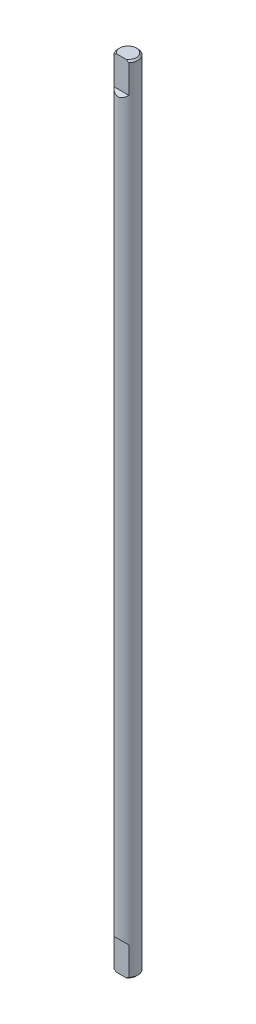
ISO-10303-21;
HEADER;
FILE_DESCRIPTION(('STEP AP214'),'2;1');
FILE_NAME('part.step','',(''),(''),'','','');
FILE_SCHEMA(('AUTOMOTIVE_DESIGN { 1 0 10303 214 1 1 1 1 }'));
ENDSEC;
DATA;
#1=APPLICATION_CONTEXT('core data for automotive mechanical design processes');
#2=APPLICATION_PROTOCOL_DEFINITION('international standard','automotive_design',2000,#1);
#3=PRODUCT_CONTEXT('',#1,'mechanical');
#4=PRODUCT('Part','Part','',(#3));
#5=PRODUCT_RELATED_PRODUCT_CATEGORY('part','',(#4));
#6=PRODUCT_DEFINITION_FORMATION('','',#4);
#7=PRODUCT_DEFINITION_CONTEXT('part definition',#1,'design');
#8=PRODUCT_DEFINITION('design','',#6,#7);
#9=PRODUCT_DEFINITION_SHAPE('','',#8);
#10=(LENGTH_UNIT() NAMED_UNIT(*) SI_UNIT(.MILLI.,.METRE.));
#11=(NAMED_UNIT(*) PLANE_ANGLE_UNIT() SI_UNIT($,.RADIAN.));
#12=(NAMED_UNIT(*) SI_UNIT($,.STERADIAN.) SOLID_ANGLE_UNIT());
#13=UNCERTAINTY_MEASURE_WITH_UNIT(LENGTH_MEASURE(1.E-05),#10,'distance_accuracy_value','');
#14=(GEOMETRIC_REPRESENTATION_CONTEXT(3) GLOBAL_UNCERTAINTY_ASSIGNED_CONTEXT((#13)) GLOBAL_UNIT_ASSIGNED_CONTEXT((#10,
#11,#12)) REPRESENTATION_CONTEXT('',''));
#15=CARTESIAN_POINT('',(0.,0.,0.));
#16=DIRECTION('',(0.,0.,1.));
#17=DIRECTION('',(1.,0.,0.));
#18=AXIS2_PLACEMENT_3D('',#15,#16,#17);
#19=CARTESIAN_POINT('',(0.,240.,0.));
#20=DIRECTION('',(0.,-1.,0.));
#21=DIRECTION('',(0.,0.,-1.));
#22=AXIS2_PLACEMENT_3D('',#19,#20,#21);
#23=CYLINDRICAL_SURFACE('',#22,3.);
#24=CARTESIAN_POINT('',(0.,239.5,0.));
#25=DIRECTION('',(0.,1.,0.));
#26=DIRECTION('',(0.,0.,1.));
#27=AXIS2_PLACEMENT_3D('',#24,#25,#26);
#28=CIRCLE('',#27,3.);
#29=CARTESIAN_POINT('',(-2.23606797749979,239.5,2.));
#30=VERTEX_POINT('',#29);
#31=CARTESIAN_POINT('',(2.23606797749979,239.5,2.));
#32=VERTEX_POINT('',#31);
#33=EDGE_CURVE('E118',#30,#32,#28,.F.);
#34=ORIENTED_EDGE('',*,*,#33,.T.);
#35=DIRECTION('',(0.,-1.,0.));
#36=VECTOR('',#35,1.);
#37=CARTESIAN_POINT('',(2.23606797749979,240.,2.));
#38=LINE('',#37,#36);
#39=CARTESIAN_POINT('',(2.23606797749979,231.,2.));
#40=VERTEX_POINT('',#39);
#41=EDGE_CURVE('E174',#32,#40,#38,.T.);
#42=ORIENTED_EDGE('',*,*,#41,.T.);
#43=CARTESIAN_POINT('',(0.,233.,0.));
#44=DIRECTION('',(0.,-0.707106781186538,-0.707106781186557));
#45=DIRECTION('',(0.,-0.707106781186557,0.707106781186538));
#46=AXIS2_PLACEMENT_3D('',#43,#44,#45);
#47=ELLIPSE('',#46,4.24264068711935,3.);
#48=CARTESIAN_POINT('',(0.,230.,3.));
#49=VERTEX_POINT('',#48);
#50=EDGE_CURVE('E59',#40,#49,#47,.T.);
#51=ORIENTED_EDGE('',*,*,#50,.T.);
#52=CARTESIAN_POINT('',(0.,233.,0.));
#53=DIRECTION('',(0.,-0.707106781186538,-0.707106781186557));
#54=DIRECTION('',(0.,-0.707106781186557,0.707106781186538));
#55=AXIS2_PLACEMENT_3D('',#52,#53,#54);
#56=ELLIPSE('',#55,4.24264068711935,3.);
#57=CARTESIAN_POINT('',(-2.23606797749979,231.,2.));
#58=VERTEX_POINT('',#57);
#59=EDGE_CURVE('E178',#49,#58,#56,.T.);
#60=ORIENTED_EDGE('',*,*,#59,.T.);
#61=DIRECTION('',(0.,-1.,0.));
#62=VECTOR('',#61,1.);
#63=CARTESIAN_POINT('',(-2.23606797749979,240.,2.));
#64=LINE('',#63,#62);
#65=EDGE_CURVE('E176',#58,#30,#64,.F.);
#66=ORIENTED_EDGE('',*,*,#65,.T.);
#67=EDGE_LOOP('',(#34,#42,#51,#60,#66));
#68=FACE_BOUND('',#67,.T.);
#69=CARTESIAN_POINT('',(0.,6.99999999999992,0.));
#70=DIRECTION('',(0.,0.707106781186538,-0.707106781186557));
#71=DIRECTION('',(0.,-0.707106781186557,-0.707106781186538));
#72=AXIS2_PLACEMENT_3D('',#69,#70,#71);
#73=ELLIPSE('',#72,4.24264068711935,3.);
#74=CARTESIAN_POINT('',(-2.23606797749979,8.99999999999998,2.));
#75=VERTEX_POINT('',#74);
#76=CARTESIAN_POINT('',(0.,10.,3.));
#77=VERTEX_POINT('',#76);
#78=EDGE_CURVE('E46',#75,#77,#73,.T.);
#79=ORIENTED_EDGE('',*,*,#78,.T.);
#80=CARTESIAN_POINT('',(0.,6.99999999999992,0.));
#81=DIRECTION('',(0.,0.707106781186538,-0.707106781186557));
#82=DIRECTION('',(0.,-0.707106781186557,-0.707106781186538));
#83=AXIS2_PLACEMENT_3D('',#80,#81,#82);
#84=ELLIPSE('',#83,4.24264068711935,3.);
#85=CARTESIAN_POINT('',(2.23606797749979,8.99999999999998,2.));
#86=VERTEX_POINT('',#85);
#87=EDGE_CURVE('E11',#77,#86,#84,.T.);
#88=ORIENTED_EDGE('',*,*,#87,.T.);
#89=DIRECTION('',(0.,-1.,0.));
#90=VECTOR('',#89,1.);
#91=CARTESIAN_POINT('',(2.23606797749979,240.,2.));
#92=LINE('',#91,#90);
#93=CARTESIAN_POINT('',(2.23606797749979,0.500000000000028,2.));
#94=VERTEX_POINT('',#93);
#95=EDGE_CURVE('E114',#86,#94,#92,.T.);
#96=ORIENTED_EDGE('',*,*,#95,.T.);
#97=CARTESIAN_POINT('',(0.,0.500000000000028,0.));
#98=DIRECTION('',(0.,1.,0.));
#99=DIRECTION('',(0.,0.,1.));
#100=AXIS2_PLACEMENT_3D('',#97,#98,#99);
#101=CIRCLE('',#100,3.);
#102=CARTESIAN_POINT('',(-2.23606797749979,0.500000000000028,2.));
#103=VERTEX_POINT('',#102);
#104=EDGE_CURVE('E121',#94,#103,#101,.T.);
#105=ORIENTED_EDGE('',*,*,#104,.T.);
#106=DIRECTION('',(0.,-1.,0.));
#107=VECTOR('',#106,1.);
#108=CARTESIAN_POINT('',(-2.23606797749979,240.,2.));
#109=LINE('',#108,#107);
#110=EDGE_CURVE('E102',#103,#75,#109,.F.);
#111=ORIENTED_EDGE('',*,*,#110,.T.);
#112=EDGE_LOOP('',(#79,#88,#96,#105,#111));
#113=FACE_BOUND('',#112,.T.);
#114=ADVANCED_FACE('F37',(#68,#113),#23,.T.);
#115=CARTESIAN_POINT('',(0.,240.,0.));
#116=DIRECTION('',(0.,1.,0.));
#117=DIRECTION('',(0.,0.,1.));
#118=AXIS2_PLACEMENT_3D('',#115,#116,#117);
#119=PLANE('',#118);
#120=DIRECTION('',(-1.,0.,0.));
#121=VECTOR('',#120,1.);
#122=CARTESIAN_POINT('',(-3.00000000000003,240.,2.));
#123=LINE('',#122,#121);
#124=CARTESIAN_POINT('',(1.49999999999991,240.,2.));
#125=VERTEX_POINT('',#124);
#126=CARTESIAN_POINT('',(-1.49999999999996,240.,2.));
#127=VERTEX_POINT('',#126);
#128=EDGE_CURVE('E115',#125,#127,#123,.T.);
#129=ORIENTED_EDGE('',*,*,#128,.F.);
#130=CARTESIAN_POINT('',(0.,240.,0.));
#131=DIRECTION('',(0.,1.,0.));
#132=DIRECTION('',(0.,0.,1.));
#133=AXIS2_PLACEMENT_3D('',#130,#131,#132);
#134=CIRCLE('',#133,2.49999999999997);
#135=EDGE_CURVE('E171',#125,#127,#134,.T.);
#136=ORIENTED_EDGE('',*,*,#135,.T.);
#137=EDGE_LOOP('',(#129,#136));
#138=FACE_BOUND('',#137,.T.);
#139=ADVANCED_FACE('F148',(#138),#119,.T.);
#140=CARTESIAN_POINT('',(0.,0.,0.));
#141=DIRECTION('',(0.,1.,0.));
#142=DIRECTION('',(0.,0.,1.));
#143=AXIS2_PLACEMENT_3D('',#140,#141,#142);
#144=PLANE('',#143);
#145=CARTESIAN_POINT('',(0.,0.,0.));
#146=DIRECTION('',(0.,1.,0.));
#147=DIRECTION('',(0.,0.,1.));
#148=AXIS2_PLACEMENT_3D('',#145,#146,#147);
#149=CIRCLE('',#148,2.49999999999997);
#150=CARTESIAN_POINT('',(-1.49999999999996,0.,2.));
#151=VERTEX_POINT('',#150);
#152=CARTESIAN_POINT('',(1.49999999999996,0.,2.));
#153=VERTEX_POINT('',#152);
#154=EDGE_CURVE('E113',#151,#153,#149,.F.);
#155=ORIENTED_EDGE('',*,*,#154,.T.);
#156=DIRECTION('',(1.,0.,0.));
#157=VECTOR('',#156,1.);
#158=CARTESIAN_POINT('',(-3.,0.,2.));
#159=LINE('',#158,#157);
#160=EDGE_CURVE('E99',#151,#153,#159,.T.);
#161=ORIENTED_EDGE('',*,*,#160,.F.);
#162=EDGE_LOOP('',(#155,#161));
#163=FACE_BOUND('',#162,.T.);
#164=ADVANCED_FACE('F112',(#163),#144,.F.);
#165=CARTESIAN_POINT('',(0.,240.,0.));
#166=DIRECTION('',(0.,-1.,0.));
#167=DIRECTION('',(0.,0.,-1.));
#168=AXIS2_PLACEMENT_3D('',#165,#166,#167);
#169=CONICAL_SURFACE('',#168,2.49999999999997,0.785398163397474);
#170=CARTESIAN_POINT('',(2.23700703843326,239.4993,2.));
#171=CARTESIAN_POINT('',(2.1795537550045,239.542119696693,2.));
#172=CARTESIAN_POINT('',(2.12175595723193,239.584485341499,2.));
#173=CARTESIAN_POINT('',(2.00532857151726,239.66809552539,2.));
#174=CARTESIAN_POINT('',(1.9466987279959,239.709339708131,2.));
#175=CARTESIAN_POINT('',(1.82791607476457,239.790867859145,2.));
#176=CARTESIAN_POINT('',(1.76775393847621,239.831138300867,2.));
#177=CARTESIAN_POINT('',(1.64632608074995,239.909969954931,2.));
#178=CARTESIAN_POINT('',(1.58506045455726,239.948531313805,2.));
#179=CARTESIAN_POINT('',(1.45793072930444,240.025557004111,2.));
#180=CARTESIAN_POINT('',(1.39199585503251,240.063906019636,2.));
#181=CARTESIAN_POINT('',(1.25849647756776,240.137645313793,2.));
#182=CARTESIAN_POINT('',(1.19093162931531,240.173034958729,2.));
#183=CARTESIAN_POINT('',(0.985963971062652,240.273358848503,2.));
#184=CARTESIAN_POINT('',(0.845675225829964,240.332835727171,2.));
#185=CARTESIAN_POINT('',(0.633672942198189,240.402985344966,2.));
#186=CARTESIAN_POINT('',(0.564986427364803,240.422823476613,2.));
#187=CARTESIAN_POINT('',(0.426067021922629,240.456231615327,2.));
#188=CARTESIAN_POINT('',(0.355834083227638,240.469801427191,2.));
#189=CARTESIAN_POINT('',(0.215656238630577,240.489579899771,2.));
#190=CARTESIAN_POINT('',(0.145730344407479,240.495920993378,2.));
#191=CARTESIAN_POINT('',(0.00559765577090717,240.501217509735,2.));
#192=CARTESIAN_POINT('',(-0.0646091160497045,240.500173515036,2.));
#193=CARTESIAN_POINT('',(-0.204457441049283,240.490787096985,2.));
#194=CARTESIAN_POINT('',(-0.274099451586293,240.482451335222,2.));
#195=CARTESIAN_POINT('',(-0.412243838195358,240.459092417786,2.));
#196=CARTESIAN_POINT('',(-0.480745979766243,240.44406790328,2.));
#197=CARTESIAN_POINT('',(-0.617448335458684,240.407917020328,2.));
#198=CARTESIAN_POINT('',(-0.685619698346276,240.386683260854,2.));
#199=CARTESIAN_POINT('',(-0.820190919096238,240.339271159789,2.));
#200=CARTESIAN_POINT('',(-0.886590808713243,240.3130929069,2.));
#201=CARTESIAN_POINT('',(-1.07054353362767,240.234035999192,2.));
#202=CARTESIAN_POINT('',(-1.18615194105939,240.176653682816,2.));
#203=CARTESIAN_POINT('',(-1.41274654442434,240.053202363559,2.));
#204=CARTESIAN_POINT('',(-1.52372413929133,239.987118067994,2.));
#205=CARTESIAN_POINT('',(-1.73664107383193,239.852459193466,2.));
#206=CARTESIAN_POINT('',(-1.83875748602178,239.78416204637,2.));
#207=CARTESIAN_POINT('',(-1.9897358196562,239.679049816604,2.));
#208=CARTESIAN_POINT('',(-2.03959293596968,239.643645516368,2.));
#209=CARTESIAN_POINT('',(-2.13871944100795,239.572039976508,2.));
#210=CARTESIAN_POINT('',(-2.1879889260501,239.535838870334,2.));
#211=CARTESIAN_POINT('',(-2.23700703843326,239.4993,2.));
#212=B_SPLINE_CURVE_WITH_KNOTS('',3,(#170,#171,#172,#173,#174,#175,#176,#177,#178,#179,#180,
#181,#182,#183,#184,#185,#186,#187,#188,#189,#190,#191,#192,#193,#194,#195,#196,#197,#198,#199,
#200,#201,#202,#203,#204,#205,#206,#207,#208,#209,#210,#211),.UNSPECIFIED.,.F.,.F.,(4,2,2,2,2,2,
2,2,2,2,2,2,2,2,2,2,2,2,2,2,4),(0.,0.214969205468666,0.430005937146404,0.647168879660764,
0.864313167232117,1.0930619511881,1.32185959290738,1.77728613144308,1.99153696336321,
2.2057944668692,2.41606021515297,2.62630937740591,2.83636666125516,3.04646663808105,
3.26044016474785,3.47440985324055,3.86098427284734,4.24824735060579,4.61667573350197,
4.80011706932143,4.98352791262719),.UNSPECIFIED.);
#213=EDGE_CURVE('E168',#32,#125,#212,.T.);
#214=ORIENTED_EDGE('',*,*,#213,.F.);
#215=ORIENTED_EDGE('',*,*,#33,.F.);
#216=EDGE_CURVE('E107',#127,#30,#212,.T.);
#217=ORIENTED_EDGE('',*,*,#216,.F.);
#218=ORIENTED_EDGE('',*,*,#135,.F.);
#219=EDGE_LOOP('',(#214,#215,#217,#218));
#220=FACE_BOUND('',#219,.T.);
#221=ADVANCED_FACE('F154',(#220),#169,.T.);
#222=CARTESIAN_POINT('',(0.,0.500000000000028,0.));
#223=DIRECTION('',(0.,1.,0.));
#224=DIRECTION('',(0.,0.,1.));
#225=AXIS2_PLACEMENT_3D('',#222,#223,#224);
#226=CONICAL_SURFACE('',#225,3.,0.785398163397446);
#227=CARTESIAN_POINT('',(-2.23700703843327,0.500700000000028,2.));
#228=CARTESIAN_POINT('',(-2.1795537550045,0.457880303307511,2.));
#229=CARTESIAN_POINT('',(-2.12175595723193,0.415514658500729,2.));
#230=CARTESIAN_POINT('',(-2.00532857151726,0.331904474610336,2.));
#231=CARTESIAN_POINT('',(-1.94669872799591,0.290660291869172,2.));
#232=CARTESIAN_POINT('',(-1.82791607476458,0.209132140854715,2.));
#233=CARTESIAN_POINT('',(-1.76775393847622,0.168861699133128,2.));
#234=CARTESIAN_POINT('',(-1.64632608074996,0.090030045068839,2.));
#235=CARTESIAN_POINT('',(-1.58506045455726,0.0514686861954147,2.));
#236=CARTESIAN_POINT('',(-1.45793072930445,-0.0255570041113463,2.));
#237=CARTESIAN_POINT('',(-1.39199585503251,-0.0639060196358761,2.));
#238=CARTESIAN_POINT('',(-1.25849647756776,-0.137645313793167,2.));
#239=CARTESIAN_POINT('',(-1.19093162931532,-0.173034958728774,2.));
#240=CARTESIAN_POINT('',(-0.98596397106267,-0.273358848503127,2.));
#241=CARTESIAN_POINT('',(-0.845675225829986,-0.332835727170973,2.));
#242=CARTESIAN_POINT('',(-0.63367294219821,-0.402985344966284,2.));
#243=CARTESIAN_POINT('',(-0.564986427364823,-0.422823476613027,2.));
#244=CARTESIAN_POINT('',(-0.426067021922656,-0.45623161532696,2.));
#245=CARTESIAN_POINT('',(-0.355834083227672,-0.469801427190927,2.));
#246=CARTESIAN_POINT('',(-0.215656238630622,-0.489579899771116,2.));
#247=CARTESIAN_POINT('',(-0.145730344407527,-0.495920993378348,2.));
#248=CARTESIAN_POINT('',(-0.00559765577096054,-0.501217509734879,2.));
#249=CARTESIAN_POINT('',(0.064609116049648,-0.500173515035874,2.));
#250=CARTESIAN_POINT('',(0.20445744104922,-0.490787096984796,2.));
#251=CARTESIAN_POINT('',(0.274099451586228,-0.482451335222434,2.));
#252=CARTESIAN_POINT('',(0.412243838195289,-0.459092417785742,2.));
#253=CARTESIAN_POINT('',(0.480745979766171,-0.444067903280064,2.));
#254=CARTESIAN_POINT('',(0.617448335458606,-0.407917020328268,2.));
#255=CARTESIAN_POINT('',(0.685619698346196,-0.386683260853592,2.));
#256=CARTESIAN_POINT('',(0.820190919096152,-0.339271159788855,2.));
#257=CARTESIAN_POINT('',(0.886590808713155,-0.313092906899623,2.));
#258=CARTESIAN_POINT('',(1.07054353362759,-0.23403599919159,2.));
#259=CARTESIAN_POINT('',(1.18615194105932,-0.176653682815571,2.));
#260=CARTESIAN_POINT('',(1.41274654442429,-0.0532023635590676,2.));
#261=CARTESIAN_POINT('',(1.52372413929129,0.012881932006253,2.));
#262=CARTESIAN_POINT('',(1.73664107383192,0.147540806534191,2.));
#263=CARTESIAN_POINT('',(1.83875748602178,0.215837953630048,2.));
#264=CARTESIAN_POINT('',(1.98973581965621,0.320950183396226,2.));
#265=CARTESIAN_POINT('',(2.03959293596968,0.356354483632019,2.));
#266=CARTESIAN_POINT('',(2.13871944100795,0.427960023491586,2.));
#267=CARTESIAN_POINT('',(2.18798892605011,0.46416112966596,2.));
#268=CARTESIAN_POINT('',(2.23700703843327,0.500700000000028,2.));
#269=B_SPLINE_CURVE_WITH_KNOTS('',3,(#227,#228,#229,#230,#231,#232,#233,#234,#235,#236,#237,
#238,#239,#240,#241,#242,#243,#244,#245,#246,#247,#248,#249,#250,#251,#252,#253,#254,#255,#256,
#257,#258,#259,#260,#261,#262,#263,#264,#265,#266,#267,#268),.UNSPECIFIED.,.F.,.F.,(4,2,2,2,2,2,
2,2,2,2,2,2,2,2,2,2,2,2,2,2,4),(0.,0.214969205468677,0.430005937146424,0.647168879660777,
0.864313167232137,1.09306195118813,1.3218595929074,1.7772861314431,1.99153696336322,
2.20579446686919,2.41606021515296,2.62630937740589,2.83636666125513,3.04646663808102,
3.2604401647478,3.47440985324049,3.86098427284731,4.24824735060582,4.61667573350206,
4.80011706932149,4.98352791262727),.UNSPECIFIED.);
#270=EDGE_CURVE('E94',#103,#151,#269,.T.);
#271=ORIENTED_EDGE('',*,*,#270,.F.);
#272=ORIENTED_EDGE('',*,*,#104,.F.);
#273=EDGE_CURVE('E108',#153,#94,#269,.T.);
#274=ORIENTED_EDGE('',*,*,#273,.F.);
#275=ORIENTED_EDGE('',*,*,#154,.F.);
#276=EDGE_LOOP('',(#271,#272,#274,#275));
#277=FACE_BOUND('',#276,.T.);
#278=ADVANCED_FACE('F117',(#277),#226,.T.);
#279=CARTESIAN_POINT('',(0.,0.,2.));
#280=DIRECTION('',(0.,0.,-1.));
#281=DIRECTION('',(-1.,0.,0.));
#282=AXIS2_PLACEMENT_3D('',#279,#280,#281);
#283=PLANE('',#282);
#284=ORIENTED_EDGE('',*,*,#95,.F.);
#285=DIRECTION('',(-1.,0.,0.));
#286=VECTOR('',#285,1.);
#287=CARTESIAN_POINT('',(0.,8.99999999999997,2.));
#288=LINE('',#287,#286);
#289=EDGE_CURVE('E188',#86,#75,#288,.T.);
#290=ORIENTED_EDGE('',*,*,#289,.T.);
#291=ORIENTED_EDGE('',*,*,#110,.F.);
#292=ORIENTED_EDGE('',*,*,#270,.T.);
#293=ORIENTED_EDGE('',*,*,#160,.T.);
#294=ORIENTED_EDGE('',*,*,#273,.T.);
#295=EDGE_LOOP('',(#284,#290,#291,#292,#293,#294));
#296=FACE_BOUND('',#295,.T.);
#297=ADVANCED_FACE('F97',(#296),#283,.F.);
#298=CARTESIAN_POINT('',(0.,0.,2.));
#299=DIRECTION('',(0.,0.,-1.));
#300=DIRECTION('',(-1.,0.,0.));
#301=AXIS2_PLACEMENT_3D('',#298,#299,#300);
#302=PLANE('',#301);
#303=ORIENTED_EDGE('',*,*,#65,.F.);
#304=DIRECTION('',(1.,0.,0.));
#305=VECTOR('',#304,1.);
#306=CARTESIAN_POINT('',(0.,231.,2.));
#307=LINE('',#306,#305);
#308=EDGE_CURVE('E173',#58,#40,#307,.T.);
#309=ORIENTED_EDGE('',*,*,#308,.T.);
#310=ORIENTED_EDGE('',*,*,#41,.F.);
#311=ORIENTED_EDGE('',*,*,#213,.T.);
#312=ORIENTED_EDGE('',*,*,#128,.T.);
#313=ORIENTED_EDGE('',*,*,#216,.T.);
#314=EDGE_LOOP('',(#303,#309,#310,#311,#312,#313));
#315=FACE_BOUND('',#314,.T.);
#316=ADVANCED_FACE('F142',(#315),#302,.F.);
#317=CARTESIAN_POINT('',(0.,231.,2.));
#318=DIRECTION('',(0.,-0.707106781186538,-0.707106781186557));
#319=DIRECTION('',(1.,0.,0.));
#320=AXIS2_PLACEMENT_3D('',#317,#318,#319);
#321=PLANE('',#320);
#322=ORIENTED_EDGE('',*,*,#308,.F.);
#323=ORIENTED_EDGE('',*,*,#59,.F.);
#324=ORIENTED_EDGE('',*,*,#50,.F.);
#325=EDGE_LOOP('',(#322,#323,#324));
#326=FACE_BOUND('',#325,.T.);
#327=ADVANCED_FACE('F146',(#326),#321,.F.);
#328=CARTESIAN_POINT('',(0.,8.99999999999997,2.));
#329=DIRECTION('',(0.,0.707106781186538,-0.707106781186557));
#330=DIRECTION('',(-1.,0.,0.));
#331=AXIS2_PLACEMENT_3D('',#328,#329,#330);
#332=PLANE('',#331);
#333=ORIENTED_EDGE('',*,*,#289,.F.);
#334=ORIENTED_EDGE('',*,*,#87,.F.);
#335=ORIENTED_EDGE('',*,*,#78,.F.);
#336=EDGE_LOOP('',(#333,#334,#335));
#337=FACE_BOUND('',#336,.T.);
#338=ADVANCED_FACE('F40',(#337),#332,.F.);
#339=CLOSED_SHELL('',(#114,#139,#164,#221,#278,#297,#316,#327,#338));
#340=MANIFOLD_SOLID_BREP('B2',#339);
#341=ADVANCED_BREP_SHAPE_REPRESENTATION('',(#18,#340),#14);
#342=SHAPE_DEFINITION_REPRESENTATION(#9,#341);
ENDSEC;
END-ISO-10303-21;
